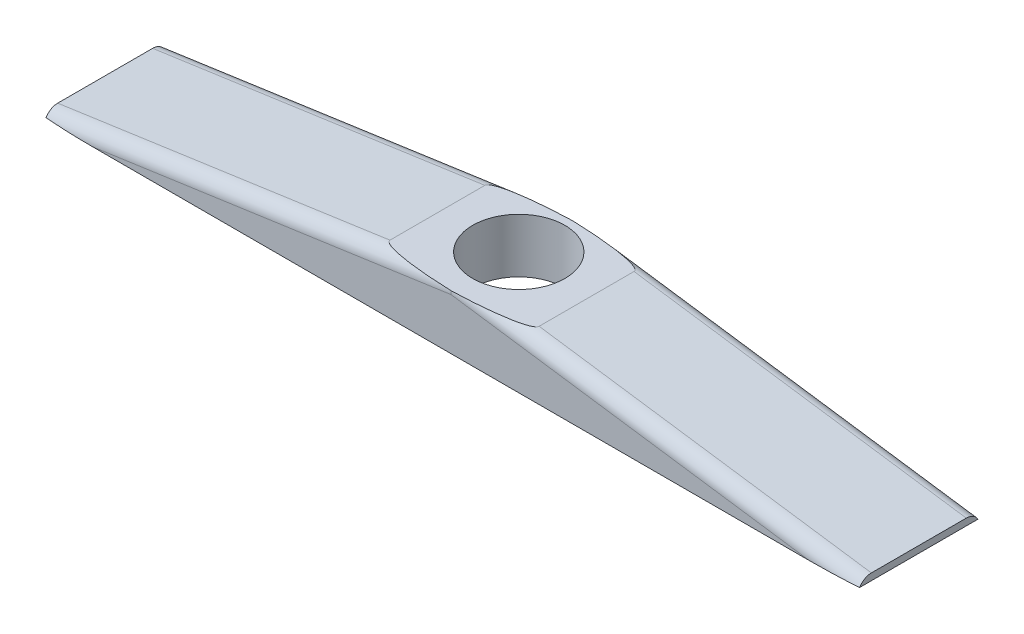
ISO-10303-21;
HEADER;
FILE_DESCRIPTION(('STEP AP214'),'2;1');
FILE_NAME('part.step','',(''),(''),'','','');
FILE_SCHEMA(('AUTOMOTIVE_DESIGN { 1 0 10303 214 1 1 1 1 }'));
ENDSEC;
DATA;
#1=APPLICATION_CONTEXT('core data for automotive mechanical design processes');
#2=APPLICATION_PROTOCOL_DEFINITION('international standard','automotive_design',2000,#1);
#3=PRODUCT_CONTEXT('',#1,'mechanical');
#4=PRODUCT('Part','Part','',(#3));
#5=PRODUCT_RELATED_PRODUCT_CATEGORY('part','',(#4));
#6=PRODUCT_DEFINITION_FORMATION('','',#4);
#7=PRODUCT_DEFINITION_CONTEXT('part definition',#1,'design');
#8=PRODUCT_DEFINITION('design','',#6,#7);
#9=PRODUCT_DEFINITION_SHAPE('','',#8);
#10=(LENGTH_UNIT() NAMED_UNIT(*) SI_UNIT(.MILLI.,.METRE.));
#11=(NAMED_UNIT(*) PLANE_ANGLE_UNIT() SI_UNIT($,.RADIAN.));
#12=(NAMED_UNIT(*) SI_UNIT($,.STERADIAN.) SOLID_ANGLE_UNIT());
#13=UNCERTAINTY_MEASURE_WITH_UNIT(LENGTH_MEASURE(1.E-05),#10,'distance_accuracy_value','');
#14=(GEOMETRIC_REPRESENTATION_CONTEXT(3) GLOBAL_UNCERTAINTY_ASSIGNED_CONTEXT((#13)) GLOBAL_UNIT_ASSIGNED_CONTEXT((#10,
#11,#12)) REPRESENTATION_CONTEXT('',''));
#15=CARTESIAN_POINT('',(0.,0.,0.));
#16=DIRECTION('',(0.,0.,1.));
#17=DIRECTION('',(1.,0.,0.));
#18=AXIS2_PLACEMENT_3D('',#15,#16,#17);
#19=CARTESIAN_POINT('',(-30.,0.5,9.));
#20=DIRECTION('',(0.141421356237309,-0.989949493661166,0.));
#21=DIRECTION('',(0.989949493661167,0.141421356237309,0.));
#22=AXIS2_PLACEMENT_3D('',#19,#20,#21);
#23=PLANE('',#22);
#24=DIRECTION('',(0.,0.,-1.));
#25=VECTOR('',#24,1.);
#26=CARTESIAN_POINT('',(-30.,0.5,9.));
#27=LINE('',#26,#25);
#28=CARTESIAN_POINT('',(-30.,0.5,8.));
#29=VERTEX_POINT('',#28);
#30=CARTESIAN_POINT('',(-30.,0.5,0.999999999999999));
#31=VERTEX_POINT('',#30);
#32=EDGE_CURVE('E176',#29,#31,#27,.T.);
#33=ORIENTED_EDGE('',*,*,#32,.F.);
#34=DIRECTION('',(-0.989949493661167,-0.141421356237309,0.));
#35=VECTOR('',#34,1.);
#36=CARTESIAN_POINT('',(-5.5,4.,8.));
#37=LINE('',#36,#35);
#38=CARTESIAN_POINT('',(-5.5,4.,8.));
#39=VERTEX_POINT('',#38);
#40=EDGE_CURVE('E197',#29,#39,#37,.F.);
#41=ORIENTED_EDGE('',*,*,#40,.T.);
#42=DIRECTION('',(0.,0.,-1.));
#43=VECTOR('',#42,1.);
#44=CARTESIAN_POINT('',(-5.5,4.,9.));
#45=LINE('',#44,#43);
#46=CARTESIAN_POINT('',(-5.5,4.,0.999999999999999));
#47=VERTEX_POINT('',#46);
#48=EDGE_CURVE('E149',#39,#47,#45,.T.);
#49=ORIENTED_EDGE('',*,*,#48,.T.);
#50=DIRECTION('',(-0.989949493661167,-0.141421356237309,0.));
#51=VECTOR('',#50,1.);
#52=CARTESIAN_POINT('',(-30.,0.5,0.999999999999999));
#53=LINE('',#52,#51);
#54=EDGE_CURVE('E193',#47,#31,#53,.T.);
#55=ORIENTED_EDGE('',*,*,#54,.T.);
#56=EDGE_LOOP('',(#33,#41,#49,#55));
#57=FACE_BOUND('',#56,.T.);
#58=ADVANCED_FACE('F39',(#57),#23,.F.);
#59=CARTESIAN_POINT('',(-30.,0.,9.));
#60=DIRECTION('',(1.,0.,0.));
#61=DIRECTION('',(0.,0.,-1.));
#62=AXIS2_PLACEMENT_3D('',#59,#60,#61);
#63=PLANE('',#62);
#64=DIRECTION('',(0.,0.,-1.));
#65=VECTOR('',#64,1.);
#66=CARTESIAN_POINT('',(-30.,0.,9.));
#67=LINE('',#66,#65);
#68=CARTESIAN_POINT('',(-30.,0.,8.86310456704919));
#69=VERTEX_POINT('',#68);
#70=CARTESIAN_POINT('',(-30.,0.,0.13689543295081));
#71=VERTEX_POINT('',#70);
#72=EDGE_CURVE('E173',#69,#71,#67,.T.);
#73=ORIENTED_EDGE('',*,*,#72,.F.);
#74=CARTESIAN_POINT('',(-30.,-0.510152544552211,8.));
#75=DIRECTION('',(1.,0.,0.));
#76=DIRECTION('',(0.,1.,0.));
#77=AXIS2_PLACEMENT_3D('',#74,#75,#76);
#78=ELLIPSE('',#77,1.01015254455221,1.);
#79=EDGE_CURVE('E126',#69,#29,#78,.F.);
#80=ORIENTED_EDGE('',*,*,#79,.T.);
#81=ORIENTED_EDGE('',*,*,#32,.T.);
#82=CARTESIAN_POINT('',(-30.,-0.510152544552211,0.999999999999999));
#83=DIRECTION('',(1.,0.,0.));
#84=DIRECTION('',(0.,-1.,0.));
#85=AXIS2_PLACEMENT_3D('',#82,#83,#84);
#86=ELLIPSE('',#85,1.01015254455221,1.);
#87=EDGE_CURVE('E132',#31,#71,#86,.F.);
#88=ORIENTED_EDGE('',*,*,#87,.T.);
#89=EDGE_LOOP('',(#73,#80,#81,#88));
#90=FACE_BOUND('',#89,.T.);
#91=ADVANCED_FACE('F249',(#90),#63,.F.);
#92=CARTESIAN_POINT('',(-30.,0.,9.));
#93=DIRECTION('',(0.,1.,0.));
#94=DIRECTION('',(0.,0.,1.));
#95=AXIS2_PLACEMENT_3D('',#92,#93,#94);
#96=PLANE('',#95);
#97=CARTESIAN_POINT('',(0.,0.,4.));
#98=DIRECTION('',(0.,1.,0.));
#99=DIRECTION('',(0.,0.,1.));
#100=AXIS2_PLACEMENT_3D('',#97,#98,#99);
#101=CIRCLE('',#100,3.4);
#102=CARTESIAN_POINT('',(0.,0.,7.4));
#103=VERTEX_POINT('',#102);
#104=EDGE_CURVE('E158',#103,#103,#101,.T.);
#105=ORIENTED_EDGE('',*,*,#104,.T.);
#106=EDGE_LOOP('',(#105));
#107=FACE_BOUND('',#106,.T.);
#108=DIRECTION('',(1.,0.,0.));
#109=VECTOR('',#108,1.);
#110=CARTESIAN_POINT('',(-30.,0.,9.));
#111=LINE('',#110,#109);
#112=CARTESIAN_POINT('',(-26.4289321881345,0.,9.));
#113=VERTEX_POINT('',#112);
#114=CARTESIAN_POINT('',(26.4289321881345,0.,9.));
#115=VERTEX_POINT('',#114);
#116=EDGE_CURVE('E138',#113,#115,#111,.T.);
#117=ORIENTED_EDGE('',*,*,#116,.F.);
#118=CARTESIAN_POINT('',(-26.4289321881345,0.,8.));
#119=DIRECTION('',(0.,1.,0.));
#120=DIRECTION('',(1.,0.,0.));
#121=AXIS2_PLACEMENT_3D('',#118,#119,#120);
#122=ELLIPSE('',#121,7.07106781186548,1.);
#123=EDGE_CURVE('E119',#113,#69,#122,.F.);
#124=ORIENTED_EDGE('',*,*,#123,.T.);
#125=ORIENTED_EDGE('',*,*,#72,.T.);
#126=CARTESIAN_POINT('',(-26.4289321881345,0.,0.999999999999999));
#127=DIRECTION('',(0.,1.,0.));
#128=DIRECTION('',(-1.,0.,0.));
#129=AXIS2_PLACEMENT_3D('',#126,#127,#128);
#130=ELLIPSE('',#129,7.07106781186548,1.);
#131=CARTESIAN_POINT('',(-26.4289321881345,0.,0.));
#132=VERTEX_POINT('',#131);
#133=EDGE_CURVE('E133',#71,#132,#130,.F.);
#134=ORIENTED_EDGE('',*,*,#133,.T.);
#135=DIRECTION('',(1.,0.,0.));
#136=VECTOR('',#135,1.);
#137=CARTESIAN_POINT('',(-30.,0.,0.));
#138=LINE('',#137,#136);
#139=CARTESIAN_POINT('',(26.4289321881345,0.,0.));
#140=VERTEX_POINT('',#139);
#141=EDGE_CURVE('E150',#132,#140,#138,.T.);
#142=ORIENTED_EDGE('',*,*,#141,.T.);
#143=CARTESIAN_POINT('',(26.4289321881345,0.,0.999999999999999));
#144=DIRECTION('',(0.,1.,0.));
#145=DIRECTION('',(-1.,0.,0.));
#146=AXIS2_PLACEMENT_3D('',#143,#144,#145);
#147=ELLIPSE('',#146,7.07106781186548,1.);
#148=CARTESIAN_POINT('',(30.,0.,0.13689543295081));
#149=VERTEX_POINT('',#148);
#150=EDGE_CURVE('E184',#140,#149,#147,.F.);
#151=ORIENTED_EDGE('',*,*,#150,.T.);
#152=DIRECTION('',(0.,0.,-1.));
#153=VECTOR('',#152,1.);
#154=CARTESIAN_POINT('',(30.,0.,9.));
#155=LINE('',#154,#153);
#156=CARTESIAN_POINT('',(30.,0.,8.86310456704919));
#157=VERTEX_POINT('',#156);
#158=EDGE_CURVE('E170',#157,#149,#155,.T.);
#159=ORIENTED_EDGE('',*,*,#158,.F.);
#160=CARTESIAN_POINT('',(26.4289321881345,0.,8.));
#161=DIRECTION('',(0.,1.,0.));
#162=DIRECTION('',(1.,0.,0.));
#163=AXIS2_PLACEMENT_3D('',#160,#161,#162);
#164=ELLIPSE('',#163,7.07106781186548,1.);
#165=EDGE_CURVE('E143',#157,#115,#164,.F.);
#166=ORIENTED_EDGE('',*,*,#165,.T.);
#167=EDGE_LOOP('',(#117,#124,#125,#134,#142,#151,#159,#166));
#168=FACE_BOUND('',#167,.T.);
#169=ADVANCED_FACE('F145',(#107,#168),#96,.F.);
#170=CARTESIAN_POINT('',(30.,0.,9.));
#171=DIRECTION('',(-1.,0.,0.));
#172=DIRECTION('',(0.,0.,1.));
#173=AXIS2_PLACEMENT_3D('',#170,#171,#172);
#174=PLANE('',#173);
#175=ORIENTED_EDGE('',*,*,#158,.T.);
#176=CARTESIAN_POINT('',(30.,-0.510152544552211,0.999999999999999));
#177=DIRECTION('',(-1.,0.,0.));
#178=DIRECTION('',(0.,1.,0.));
#179=AXIS2_PLACEMENT_3D('',#176,#177,#178);
#180=ELLIPSE('',#179,1.01015254455221,1.);
#181=CARTESIAN_POINT('',(30.,0.5,0.999999999999999));
#182=VERTEX_POINT('',#181);
#183=EDGE_CURVE('E11',#149,#182,#180,.F.);
#184=ORIENTED_EDGE('',*,*,#183,.T.);
#185=DIRECTION('',(0.,0.,-1.));
#186=VECTOR('',#185,1.);
#187=CARTESIAN_POINT('',(30.,0.5,9.));
#188=LINE('',#187,#186);
#189=CARTESIAN_POINT('',(30.,0.5,8.));
#190=VERTEX_POINT('',#189);
#191=EDGE_CURVE('E167',#190,#182,#188,.T.);
#192=ORIENTED_EDGE('',*,*,#191,.F.);
#193=CARTESIAN_POINT('',(30.,-0.510152544552211,8.));
#194=DIRECTION('',(-1.,0.,0.));
#195=DIRECTION('',(0.,-1.,0.));
#196=AXIS2_PLACEMENT_3D('',#193,#194,#195);
#197=ELLIPSE('',#196,1.01015254455221,1.);
#198=EDGE_CURVE('E49',#190,#157,#197,.F.);
#199=ORIENTED_EDGE('',*,*,#198,.T.);
#200=EDGE_LOOP('',(#175,#184,#192,#199));
#201=FACE_BOUND('',#200,.T.);
#202=ADVANCED_FACE('F256',(#201),#174,.F.);
#203=CARTESIAN_POINT('',(30.,0.5,9.));
#204=DIRECTION('',(-0.141421356237309,-0.989949493661166,0.));
#205=DIRECTION('',(0.989949493661167,-0.141421356237309,0.));
#206=AXIS2_PLACEMENT_3D('',#203,#204,#205);
#207=PLANE('',#206);
#208=ORIENTED_EDGE('',*,*,#191,.T.);
#209=DIRECTION('',(-0.989949493661167,0.141421356237309,0.));
#210=VECTOR('',#209,1.);
#211=CARTESIAN_POINT('',(30.,0.5,0.999999999999999));
#212=LINE('',#211,#210);
#213=CARTESIAN_POINT('',(5.5,4.,0.999999999999999));
#214=VERTEX_POINT('',#213);
#215=EDGE_CURVE('E220',#182,#214,#212,.T.);
#216=ORIENTED_EDGE('',*,*,#215,.T.);
#217=DIRECTION('',(0.,0.,-1.));
#218=VECTOR('',#217,1.);
#219=CARTESIAN_POINT('',(5.5,4.,9.));
#220=LINE('',#219,#218);
#221=CARTESIAN_POINT('',(5.5,4.,8.));
#222=VERTEX_POINT('',#221);
#223=EDGE_CURVE('E155',#222,#214,#220,.T.);
#224=ORIENTED_EDGE('',*,*,#223,.F.);
#225=DIRECTION('',(-0.989949493661167,0.141421356237309,0.));
#226=VECTOR('',#225,1.);
#227=CARTESIAN_POINT('',(30.,0.5,8.));
#228=LINE('',#227,#226);
#229=EDGE_CURVE('E62',#222,#190,#228,.F.);
#230=ORIENTED_EDGE('',*,*,#229,.T.);
#231=EDGE_LOOP('',(#208,#216,#224,#230));
#232=FACE_BOUND('',#231,.T.);
#233=ADVANCED_FACE('F309',(#232),#207,.F.);
#234=CARTESIAN_POINT('',(5.5,4.,9.));
#235=DIRECTION('',(0.,-1.,0.));
#236=DIRECTION('',(0.,0.,-1.));
#237=AXIS2_PLACEMENT_3D('',#234,#235,#236);
#238=PLANE('',#237);
#239=CARTESIAN_POINT('',(0.,4.,4.));
#240=DIRECTION('',(0.,1.,0.));
#241=DIRECTION('',(0.,0.,1.));
#242=AXIS2_PLACEMENT_3D('',#239,#240,#241);
#243=CIRCLE('',#242,3.4);
#244=CARTESIAN_POINT('',(0.,4.,7.4));
#245=VERTEX_POINT('',#244);
#246=EDGE_CURVE('E161',#245,#245,#243,.T.);
#247=ORIENTED_EDGE('',*,*,#246,.F.);
#248=EDGE_LOOP('',(#247));
#249=FACE_BOUND('',#248,.T.);
#250=CARTESIAN_POINT('',(-1.57106781186548,4.,0.999999999999999));
#251=DIRECTION('',(0.,-1.,0.));
#252=DIRECTION('',(-1.,0.,0.));
#253=AXIS2_PLACEMENT_3D('',#250,#251,#252);
#254=ELLIPSE('',#253,7.07106781186548,1.);
#255=CARTESIAN_POINT('',(0.,4.,0.0249949135463952));
#256=VERTEX_POINT('',#255);
#257=EDGE_CURVE('E206',#214,#256,#254,.F.);
#258=ORIENTED_EDGE('',*,*,#257,.T.);
#259=CARTESIAN_POINT('',(1.57106781186548,4.,0.999999999999999));
#260=DIRECTION('',(0.,-1.,0.));
#261=DIRECTION('',(-1.,0.,0.));
#262=AXIS2_PLACEMENT_3D('',#259,#260,#261);
#263=ELLIPSE('',#262,7.07106781186548,1.);
#264=EDGE_CURVE('E209',#256,#47,#263,.F.);
#265=ORIENTED_EDGE('',*,*,#264,.T.);
#266=ORIENTED_EDGE('',*,*,#48,.F.);
#267=CARTESIAN_POINT('',(1.57106781186548,4.,8.));
#268=DIRECTION('',(0.,-1.,0.));
#269=DIRECTION('',(1.,0.,0.));
#270=AXIS2_PLACEMENT_3D('',#267,#268,#269);
#271=ELLIPSE('',#270,7.07106781186548,1.);
#272=CARTESIAN_POINT('',(0.,4.,8.97500508645361));
#273=VERTEX_POINT('',#272);
#274=EDGE_CURVE('E203',#39,#273,#271,.F.);
#275=ORIENTED_EDGE('',*,*,#274,.T.);
#276=CARTESIAN_POINT('',(-1.57106781186548,4.,8.));
#277=DIRECTION('',(0.,-1.,0.));
#278=DIRECTION('',(1.,0.,0.));
#279=AXIS2_PLACEMENT_3D('',#276,#277,#278);
#280=ELLIPSE('',#279,7.07106781186548,1.);
#281=EDGE_CURVE('E200',#273,#222,#280,.F.);
#282=ORIENTED_EDGE('',*,*,#281,.T.);
#283=ORIENTED_EDGE('',*,*,#223,.T.);
#284=EDGE_LOOP('',(#258,#265,#266,#275,#282,#283));
#285=FACE_BOUND('',#284,.T.);
#286=ADVANCED_FACE('F302',(#249,#285),#238,.F.);
#287=CARTESIAN_POINT('',(0.,0.,9.));
#288=DIRECTION('',(0.,0.,1.));
#289=DIRECTION('',(1.,0.,0.));
#290=AXIS2_PLACEMENT_3D('',#287,#288,#289);
#291=PLANE('',#290);
#292=DIRECTION('',(-0.989949493661167,0.141421356237309,0.));
#293=VECTOR('',#292,1.);
#294=CARTESIAN_POINT('',(5.35857864376269,3.01005050633883,9.));
#295=LINE('',#294,#293);
#296=CARTESIAN_POINT('',(1.18828558104411E-13,3.77556174116206,9.));
#297=VERTEX_POINT('',#296);
#298=EDGE_CURVE('E140',#115,#297,#295,.T.);
#299=ORIENTED_EDGE('',*,*,#298,.T.);
#300=DIRECTION('',(-0.989949493661167,-0.141421356237309,0.));
#301=VECTOR('',#300,1.);
#302=CARTESIAN_POINT('',(-29.8585786437627,-0.489949493661166,9.));
#303=LINE('',#302,#301);
#304=EDGE_CURVE('E124',#297,#113,#303,.T.);
#305=ORIENTED_EDGE('',*,*,#304,.T.);
#306=ORIENTED_EDGE('',*,*,#116,.T.);
#307=EDGE_LOOP('',(#299,#305,#306));
#308=FACE_BOUND('',#307,.T.);
#309=ADVANCED_FACE('F137',(#308),#291,.T.);
#310=CARTESIAN_POINT('',(0.,0.,0.));
#311=DIRECTION('',(0.,0.,1.));
#312=DIRECTION('',(1.,0.,0.));
#313=AXIS2_PLACEMENT_3D('',#310,#311,#312);
#314=PLANE('',#313);
#315=ORIENTED_EDGE('',*,*,#141,.F.);
#316=DIRECTION('',(-0.989949493661167,-0.141421356237309,0.));
#317=VECTOR('',#316,1.);
#318=CARTESIAN_POINT('',(-0.52857864376269,3.70005050633883,0.));
#319=LINE('',#318,#317);
#320=CARTESIAN_POINT('',(0.,3.77556174116207,0.));
#321=VERTEX_POINT('',#320);
#322=EDGE_CURVE('E215',#132,#321,#319,.F.);
#323=ORIENTED_EDGE('',*,*,#322,.T.);
#324=DIRECTION('',(-0.989949493661167,0.141421356237309,0.));
#325=VECTOR('',#324,1.);
#326=CARTESIAN_POINT('',(0.52857864376269,3.70005050633883,0.));
#327=LINE('',#326,#325);
#328=EDGE_CURVE('E212',#321,#140,#327,.F.);
#329=ORIENTED_EDGE('',*,*,#328,.T.);
#330=EDGE_LOOP('',(#315,#323,#329));
#331=FACE_BOUND('',#330,.T.);
#332=ADVANCED_FACE('F244',(#331),#314,.F.);
#333=CARTESIAN_POINT('',(0.,0.,4.));
#334=DIRECTION('',(0.,1.,0.));
#335=DIRECTION('',(0.,0.,1.));
#336=AXIS2_PLACEMENT_3D('',#333,#334,#335);
#337=CYLINDRICAL_SURFACE('',#336,3.4);
#338=ORIENTED_EDGE('',*,*,#104,.F.);
#339=EDGE_LOOP('',(#338));
#340=FACE_BOUND('',#339,.T.);
#341=ORIENTED_EDGE('',*,*,#246,.T.);
#342=EDGE_LOOP('',(#341));
#343=FACE_BOUND('',#342,.T.);
#344=ADVANCED_FACE('F266',(#340,#343),#337,.F.);
#345=CARTESIAN_POINT('',(0.52857864376269,3.70005050633883,8.));
#346=DIRECTION('',(0.989949493661167,-0.141421356237309,0.));
#347=DIRECTION('',(0.141421356237309,0.989949493661167,0.));
#348=AXIS2_PLACEMENT_3D('',#345,#346,#347);
#349=CYLINDRICAL_SURFACE('',#348,1.);
#350=ORIENTED_EDGE('',*,*,#229,.F.);
#351=ORIENTED_EDGE('',*,*,#281,.F.);
#352=CARTESIAN_POINT('',(0.,3.77556174116207,8.));
#353=DIRECTION('',(1.,0.,0.));
#354=DIRECTION('',(0.,1.,0.));
#355=AXIS2_PLACEMENT_3D('',#352,#353,#354);
#356=ELLIPSE('',#355,1.01015254455221,1.);
#357=EDGE_CURVE('E224',#297,#273,#356,.F.);
#358=ORIENTED_EDGE('',*,*,#357,.F.);
#359=ORIENTED_EDGE('',*,*,#298,.F.);
#360=ORIENTED_EDGE('',*,*,#165,.F.);
#361=ORIENTED_EDGE('',*,*,#198,.F.);
#362=EDGE_LOOP('',(#350,#351,#358,#359,#360,#361));
#363=FACE_BOUND('',#362,.T.);
#364=ADVANCED_FACE('F264',(#363),#349,.T.);
#365=CARTESIAN_POINT('',(-0.52857864376269,3.70005050633883,8.));
#366=DIRECTION('',(0.989949493661167,0.141421356237309,0.));
#367=DIRECTION('',(-0.141421356237309,0.989949493661167,0.));
#368=AXIS2_PLACEMENT_3D('',#365,#366,#367);
#369=CYLINDRICAL_SURFACE('',#368,1.);
#370=ORIENTED_EDGE('',*,*,#274,.F.);
#371=ORIENTED_EDGE('',*,*,#40,.F.);
#372=ORIENTED_EDGE('',*,*,#79,.F.);
#373=ORIENTED_EDGE('',*,*,#123,.F.);
#374=ORIENTED_EDGE('',*,*,#304,.F.);
#375=ORIENTED_EDGE('',*,*,#357,.T.);
#376=EDGE_LOOP('',(#370,#371,#372,#373,#374,#375));
#377=FACE_BOUND('',#376,.T.);
#378=ADVANCED_FACE('F122',(#377),#369,.T.);
#379=CARTESIAN_POINT('',(29.8585786437627,-0.489949493661166,0.999999999999999));
#380=DIRECTION('',(-0.989949493661167,0.141421356237309,0.));
#381=DIRECTION('',(-0.141421356237309,-0.989949493661167,0.));
#382=AXIS2_PLACEMENT_3D('',#379,#380,#381);
#383=CYLINDRICAL_SURFACE('',#382,1.);
#384=ORIENTED_EDGE('',*,*,#150,.F.);
#385=ORIENTED_EDGE('',*,*,#328,.F.);
#386=CARTESIAN_POINT('',(0.,3.77556174116207,0.999999999999999));
#387=DIRECTION('',(-1.,0.,0.));
#388=DIRECTION('',(0.,1.,0.));
#389=AXIS2_PLACEMENT_3D('',#386,#387,#388);
#390=ELLIPSE('',#389,1.01015254455221,1.);
#391=EDGE_CURVE('E43',#256,#321,#390,.T.);
#392=ORIENTED_EDGE('',*,*,#391,.F.);
#393=ORIENTED_EDGE('',*,*,#257,.F.);
#394=ORIENTED_EDGE('',*,*,#215,.F.);
#395=ORIENTED_EDGE('',*,*,#183,.F.);
#396=EDGE_LOOP('',(#384,#385,#392,#393,#394,#395));
#397=FACE_BOUND('',#396,.T.);
#398=ADVANCED_FACE('F41',(#397),#383,.T.);
#399=CARTESIAN_POINT('',(-29.8585786437627,-0.489949493661166,0.999999999999999));
#400=DIRECTION('',(-0.989949493661167,-0.141421356237309,0.));
#401=DIRECTION('',(0.141421356237309,-0.989949493661167,0.));
#402=AXIS2_PLACEMENT_3D('',#399,#400,#401);
#403=CYLINDRICAL_SURFACE('',#402,1.);
#404=ORIENTED_EDGE('',*,*,#391,.T.);
#405=ORIENTED_EDGE('',*,*,#322,.F.);
#406=ORIENTED_EDGE('',*,*,#133,.F.);
#407=ORIENTED_EDGE('',*,*,#87,.F.);
#408=ORIENTED_EDGE('',*,*,#54,.F.);
#409=ORIENTED_EDGE('',*,*,#264,.F.);
#410=EDGE_LOOP('',(#404,#405,#406,#407,#408,#409));
#411=FACE_BOUND('',#410,.T.);
#412=ADVANCED_FACE('F234',(#411),#403,.T.);
#413=CLOSED_SHELL('',(#58,#91,#169,#202,#233,#286,#309,#332,#344,#364,#378,#398,#412));
#414=MANIFOLD_SOLID_BREP('B2',#413);
#415=ADVANCED_BREP_SHAPE_REPRESENTATION('',(#18,#414),#14);
#416=SHAPE_DEFINITION_REPRESENTATION(#9,#415);
ENDSEC;
END-ISO-10303-21;
